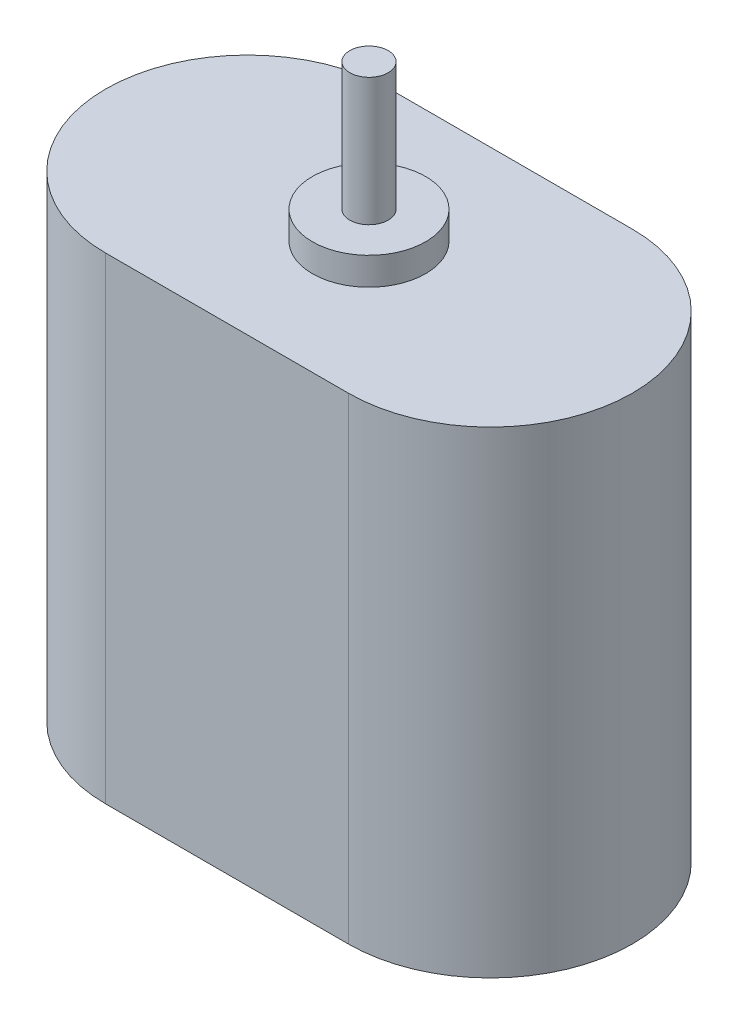
ISO-10303-21;
HEADER;
FILE_DESCRIPTION(('STEP AP214'),'2;1');
FILE_NAME('part.step','',(''),(''),'','','');
FILE_SCHEMA(('AUTOMOTIVE_DESIGN { 1 0 10303 214 1 1 1 1 }'));
ENDSEC;
DATA;
#1=APPLICATION_CONTEXT('core data for automotive mechanical design processes');
#2=APPLICATION_PROTOCOL_DEFINITION('international standard','automotive_design',2000,#1);
#3=PRODUCT_CONTEXT('',#1,'mechanical');
#4=PRODUCT('Part','Part','',(#3));
#5=PRODUCT_RELATED_PRODUCT_CATEGORY('part','',(#4));
#6=PRODUCT_DEFINITION_FORMATION('','',#4);
#7=PRODUCT_DEFINITION_CONTEXT('part definition',#1,'design');
#8=PRODUCT_DEFINITION('design','',#6,#7);
#9=PRODUCT_DEFINITION_SHAPE('','',#8);
#10=(LENGTH_UNIT() NAMED_UNIT(*) SI_UNIT(.MILLI.,.METRE.));
#11=(NAMED_UNIT(*) PLANE_ANGLE_UNIT() SI_UNIT($,.RADIAN.));
#12=(NAMED_UNIT(*) SI_UNIT($,.STERADIAN.) SOLID_ANGLE_UNIT());
#13=UNCERTAINTY_MEASURE_WITH_UNIT(LENGTH_MEASURE(1.E-05),#10,'distance_accuracy_value','');
#14=(GEOMETRIC_REPRESENTATION_CONTEXT(3) GLOBAL_UNCERTAINTY_ASSIGNED_CONTEXT((#13)) GLOBAL_UNIT_ASSIGNED_CONTEXT((#10,
#11,#12)) REPRESENTATION_CONTEXT('',''));
#15=CARTESIAN_POINT('',(0.,0.,0.));
#16=DIRECTION('',(0.,0.,1.));
#17=DIRECTION('',(1.,0.,0.));
#18=AXIS2_PLACEMENT_3D('',#15,#16,#17);
#19=CARTESIAN_POINT('',(0.,0.,0.));
#20=DIRECTION('',(0.,1.,0.));
#21=DIRECTION('',(0.,0.,1.));
#22=AXIS2_PLACEMENT_3D('',#19,#20,#21);
#23=PLANE('',#22);
#24=CARTESIAN_POINT('',(-6.35,0.,0.));
#25=DIRECTION('',(0.,1.,0.));
#26=DIRECTION('',(0.,0.,1.));
#27=AXIS2_PLACEMENT_3D('',#24,#25,#26);
#28=CIRCLE('',#27,7.4295);
#29=CARTESIAN_POINT('',(-6.35,0.,-7.4295));
#30=VERTEX_POINT('',#29);
#31=CARTESIAN_POINT('',(-6.35,0.,7.4295));
#32=VERTEX_POINT('',#31);
#33=EDGE_CURVE('E148',#30,#32,#28,.T.);
#34=ORIENTED_EDGE('',*,*,#33,.F.);
#35=DIRECTION('',(1.,0.,0.));
#36=VECTOR('',#35,1.);
#37=CARTESIAN_POINT('',(0.,0.,-7.4295));
#38=LINE('',#37,#36);
#39=CARTESIAN_POINT('',(6.35,0.,-7.4295));
#40=VERTEX_POINT('',#39);
#41=EDGE_CURVE('E152',#30,#40,#38,.T.);
#42=ORIENTED_EDGE('',*,*,#41,.T.);
#43=CARTESIAN_POINT('',(6.35,0.,0.));
#44=DIRECTION('',(0.,1.,0.));
#45=DIRECTION('',(0.,0.,1.));
#46=AXIS2_PLACEMENT_3D('',#43,#44,#45);
#47=CIRCLE('',#46,7.4295);
#48=CARTESIAN_POINT('',(6.35,0.,7.4295));
#49=VERTEX_POINT('',#48);
#50=EDGE_CURVE('E161',#49,#40,#47,.T.);
#51=ORIENTED_EDGE('',*,*,#50,.F.);
#52=DIRECTION('',(1.,0.,0.));
#53=VECTOR('',#52,1.);
#54=CARTESIAN_POINT('',(0.,0.,7.4295));
#55=LINE('',#54,#53);
#56=EDGE_CURVE('E159',#32,#49,#55,.T.);
#57=ORIENTED_EDGE('',*,*,#56,.F.);
#58=EDGE_LOOP('',(#34,#42,#51,#57));
#59=FACE_BOUND('',#58,.T.);
#60=CARTESIAN_POINT('',(0.,0.,0.));
#61=DIRECTION('',(0.,-1.,0.));
#62=DIRECTION('',(0.,0.,-1.));
#63=AXIS2_PLACEMENT_3D('',#60,#61,#62);
#64=CIRCLE('',#63,4.9022);
#65=CARTESIAN_POINT('',(2.81527806797126,0.,-4.0132));
#66=VERTEX_POINT('',#65);
#67=CARTESIAN_POINT('',(-2.81527806797126,0.,-4.0132));
#68=VERTEX_POINT('',#67);
#69=EDGE_CURVE('E135',#66,#68,#64,.T.);
#70=ORIENTED_EDGE('',*,*,#69,.F.);
#71=DIRECTION('',(1.,0.,0.));
#72=VECTOR('',#71,1.);
#73=CARTESIAN_POINT('',(-2.81527806797126,0.,-4.0132));
#74=LINE('',#73,#72);
#75=EDGE_CURVE('E72',#68,#66,#74,.T.);
#76=ORIENTED_EDGE('',*,*,#75,.F.);
#77=EDGE_LOOP('',(#70,#76));
#78=FACE_BOUND('',#77,.T.);
#79=ADVANCED_FACE('F57',(#59,#78),#23,.F.);
#80=CARTESIAN_POINT('',(-6.35,24.9555,0.));
#81=DIRECTION('',(0.,-1.,0.));
#82=DIRECTION('',(0.,0.,-1.));
#83=AXIS2_PLACEMENT_3D('',#80,#81,#82);
#84=CYLINDRICAL_SURFACE('',#83,7.4295);
#85=ORIENTED_EDGE('',*,*,#33,.T.);
#86=DIRECTION('',(0.,-1.,0.));
#87=VECTOR('',#86,1.);
#88=CARTESIAN_POINT('',(-6.35,24.9555,7.4295));
#89=LINE('',#88,#87);
#90=CARTESIAN_POINT('',(-6.35,24.9555,7.4295));
#91=VERTEX_POINT('',#90);
#92=EDGE_CURVE('E61',#91,#32,#89,.T.);
#93=ORIENTED_EDGE('',*,*,#92,.F.);
#94=CARTESIAN_POINT('',(-6.35,24.9555,0.));
#95=DIRECTION('',(0.,1.,0.));
#96=DIRECTION('',(0.,0.,1.));
#97=AXIS2_PLACEMENT_3D('',#94,#95,#96);
#98=CIRCLE('',#97,7.4295);
#99=CARTESIAN_POINT('',(-6.35,24.9555,-7.4295));
#100=VERTEX_POINT('',#99);
#101=EDGE_CURVE('E150',#100,#91,#98,.T.);
#102=ORIENTED_EDGE('',*,*,#101,.F.);
#103=DIRECTION('',(0.,-1.,0.));
#104=VECTOR('',#103,1.);
#105=CARTESIAN_POINT('',(-6.35,24.9555,-7.4295));
#106=LINE('',#105,#104);
#107=EDGE_CURVE('E81',#100,#30,#106,.T.);
#108=ORIENTED_EDGE('',*,*,#107,.T.);
#109=EDGE_LOOP('',(#85,#93,#102,#108));
#110=FACE_BOUND('',#109,.T.);
#111=ADVANCED_FACE('F59',(#110),#84,.T.);
#112=CARTESIAN_POINT('',(0.,24.9555,7.4295));
#113=DIRECTION('',(0.,0.,-1.));
#114=DIRECTION('',(-1.,0.,0.));
#115=AXIS2_PLACEMENT_3D('',#112,#113,#114);
#116=PLANE('',#115);
#117=ORIENTED_EDGE('',*,*,#56,.T.);
#118=DIRECTION('',(0.,-1.,0.));
#119=VECTOR('',#118,1.);
#120=CARTESIAN_POINT('',(6.35,24.9555,7.4295));
#121=LINE('',#120,#119);
#122=CARTESIAN_POINT('',(6.35,24.9555,7.4295));
#123=VERTEX_POINT('',#122);
#124=EDGE_CURVE('E168',#123,#49,#121,.T.);
#125=ORIENTED_EDGE('',*,*,#124,.F.);
#126=DIRECTION('',(1.,0.,0.));
#127=VECTOR('',#126,1.);
#128=CARTESIAN_POINT('',(0.,24.9555,7.4295));
#129=LINE('',#128,#127);
#130=EDGE_CURVE('E108',#91,#123,#129,.T.);
#131=ORIENTED_EDGE('',*,*,#130,.F.);
#132=ORIENTED_EDGE('',*,*,#92,.T.);
#133=EDGE_LOOP('',(#117,#125,#131,#132));
#134=FACE_BOUND('',#133,.T.);
#135=ADVANCED_FACE('F174',(#134),#116,.F.);
#136=CARTESIAN_POINT('',(6.35,24.9555,0.));
#137=DIRECTION('',(0.,-1.,0.));
#138=DIRECTION('',(0.,0.,-1.));
#139=AXIS2_PLACEMENT_3D('',#136,#137,#138);
#140=CYLINDRICAL_SURFACE('',#139,7.4295);
#141=ORIENTED_EDGE('',*,*,#50,.T.);
#142=DIRECTION('',(0.,-1.,0.));
#143=VECTOR('',#142,1.);
#144=CARTESIAN_POINT('',(6.35,24.9555,-7.4295));
#145=LINE('',#144,#143);
#146=CARTESIAN_POINT('',(6.35,24.9555,-7.4295));
#147=VERTEX_POINT('',#146);
#148=EDGE_CURVE('E167',#147,#40,#145,.T.);
#149=ORIENTED_EDGE('',*,*,#148,.F.);
#150=CARTESIAN_POINT('',(6.35,24.9555,0.));
#151=DIRECTION('',(0.,1.,0.));
#152=DIRECTION('',(0.,0.,1.));
#153=AXIS2_PLACEMENT_3D('',#150,#151,#152);
#154=CIRCLE('',#153,7.4295);
#155=EDGE_CURVE('E154',#123,#147,#154,.T.);
#156=ORIENTED_EDGE('',*,*,#155,.F.);
#157=ORIENTED_EDGE('',*,*,#124,.T.);
#158=EDGE_LOOP('',(#141,#149,#156,#157));
#159=FACE_BOUND('',#158,.T.);
#160=ADVANCED_FACE('F179',(#159),#140,.T.);
#161=CARTESIAN_POINT('',(0.,24.9555,-7.4295));
#162=DIRECTION('',(0.,0.,-1.));
#163=DIRECTION('',(-1.,0.,0.));
#164=AXIS2_PLACEMENT_3D('',#161,#162,#163);
#165=PLANE('',#164);
#166=ORIENTED_EDGE('',*,*,#41,.F.);
#167=ORIENTED_EDGE('',*,*,#107,.F.);
#168=DIRECTION('',(1.,0.,0.));
#169=VECTOR('',#168,1.);
#170=CARTESIAN_POINT('',(0.,24.9555,-7.4295));
#171=LINE('',#170,#169);
#172=EDGE_CURVE('E156',#100,#147,#171,.T.);
#173=ORIENTED_EDGE('',*,*,#172,.T.);
#174=ORIENTED_EDGE('',*,*,#148,.T.);
#175=EDGE_LOOP('',(#166,#167,#173,#174));
#176=FACE_BOUND('',#175,.T.);
#177=ADVANCED_FACE('F176',(#176),#165,.T.);
#178=CARTESIAN_POINT('',(0.,24.9555,0.));
#179=DIRECTION('',(0.,1.,0.));
#180=DIRECTION('',(0.,0.,1.));
#181=AXIS2_PLACEMENT_3D('',#178,#179,#180);
#182=PLANE('',#181);
#183=CARTESIAN_POINT('',(0.,24.9555,0.));
#184=DIRECTION('',(0.,1.,0.));
#185=DIRECTION('',(0.,0.,1.));
#186=AXIS2_PLACEMENT_3D('',#183,#184,#185);
#187=CIRCLE('',#186,2.96037);
#188=CARTESIAN_POINT('',(0.,24.9555,2.96037));
#189=VERTEX_POINT('',#188);
#190=EDGE_CURVE('E13',#189,#189,#187,.T.);
#191=ORIENTED_EDGE('',*,*,#190,.F.);
#192=EDGE_LOOP('',(#191));
#193=FACE_BOUND('',#192,.T.);
#194=ORIENTED_EDGE('',*,*,#101,.T.);
#195=ORIENTED_EDGE('',*,*,#130,.T.);
#196=ORIENTED_EDGE('',*,*,#155,.T.);
#197=ORIENTED_EDGE('',*,*,#172,.F.);
#198=EDGE_LOOP('',(#194,#195,#196,#197));
#199=FACE_BOUND('',#198,.T.);
#200=ADVANCED_FACE('F186',(#193,#199),#182,.T.);
#201=CARTESIAN_POINT('',(0.,26.4033,0.));
#202=DIRECTION('',(0.,1.,0.));
#203=DIRECTION('',(0.,0.,1.));
#204=AXIS2_PLACEMENT_3D('',#201,#202,#203);
#205=PLANE('',#204);
#206=CARTESIAN_POINT('',(0.,26.4033,0.));
#207=DIRECTION('',(0.,1.,0.));
#208=DIRECTION('',(0.,0.,1.));
#209=AXIS2_PLACEMENT_3D('',#206,#207,#208);
#210=CIRCLE('',#209,2.96037);
#211=CARTESIAN_POINT('',(0.,26.4033,2.96037));
#212=VERTEX_POINT('',#211);
#213=EDGE_CURVE('E146',#212,#212,#210,.T.);
#214=ORIENTED_EDGE('',*,*,#213,.T.);
#215=EDGE_LOOP('',(#214));
#216=FACE_BOUND('',#215,.T.);
#217=CARTESIAN_POINT('',(0.,26.4033,0.));
#218=DIRECTION('',(0.,1.,0.));
#219=DIRECTION('',(0.,0.,1.));
#220=AXIS2_PLACEMENT_3D('',#217,#218,#219);
#221=CIRCLE('',#220,1.0033);
#222=CARTESIAN_POINT('',(0.,26.4033,1.0033));
#223=VERTEX_POINT('',#222);
#224=EDGE_CURVE('E139',#223,#223,#221,.T.);
#225=ORIENTED_EDGE('',*,*,#224,.F.);
#226=EDGE_LOOP('',(#225));
#227=FACE_BOUND('',#226,.T.);
#228=ADVANCED_FACE('F198',(#216,#227),#205,.T.);
#229=CARTESIAN_POINT('',(0.,26.4033,0.));
#230=DIRECTION('',(0.,-1.,0.));
#231=DIRECTION('',(0.,0.,-1.));
#232=AXIS2_PLACEMENT_3D('',#229,#230,#231);
#233=CYLINDRICAL_SURFACE('',#232,2.96037);
#234=ORIENTED_EDGE('',*,*,#213,.F.);
#235=EDGE_LOOP('',(#234));
#236=FACE_BOUND('',#235,.T.);
#237=ORIENTED_EDGE('',*,*,#190,.T.);
#238=EDGE_LOOP('',(#237));
#239=FACE_BOUND('',#238,.T.);
#240=ADVANCED_FACE('F200',(#236,#239),#233,.T.);
#241=CARTESIAN_POINT('',(0.,33.0835,0.));
#242=DIRECTION('',(0.,-1.,0.));
#243=DIRECTION('',(0.,0.,-1.));
#244=AXIS2_PLACEMENT_3D('',#241,#242,#243);
#245=CYLINDRICAL_SURFACE('',#244,1.0033);
#246=ORIENTED_EDGE('',*,*,#224,.T.);
#247=EDGE_LOOP('',(#246));
#248=FACE_BOUND('',#247,.T.);
#249=CARTESIAN_POINT('',(0.,33.0835,0.));
#250=DIRECTION('',(0.,1.,0.));
#251=DIRECTION('',(0.,0.,1.));
#252=AXIS2_PLACEMENT_3D('',#249,#250,#251);
#253=CIRCLE('',#252,1.0033);
#254=CARTESIAN_POINT('',(0.,33.0835,1.0033));
#255=VERTEX_POINT('',#254);
#256=EDGE_CURVE('E136',#255,#255,#253,.T.);
#257=ORIENTED_EDGE('',*,*,#256,.F.);
#258=EDGE_LOOP('',(#257));
#259=FACE_BOUND('',#258,.T.);
#260=ADVANCED_FACE('F203',(#248,#259),#245,.T.);
#261=CARTESIAN_POINT('',(0.,33.0835,0.));
#262=DIRECTION('',(0.,1.,0.));
#263=DIRECTION('',(0.,0.,1.));
#264=AXIS2_PLACEMENT_3D('',#261,#262,#263);
#265=PLANE('',#264);
#266=ORIENTED_EDGE('',*,*,#256,.T.);
#267=EDGE_LOOP('',(#266));
#268=FACE_BOUND('',#267,.T.);
#269=ADVANCED_FACE('F210',(#268),#265,.T.);
#270=CARTESIAN_POINT('',(0.,-1.905,0.));
#271=DIRECTION('',(0.,1.,0.));
#272=DIRECTION('',(0.,0.,1.));
#273=AXIS2_PLACEMENT_3D('',#270,#271,#272);
#274=CYLINDRICAL_SURFACE('',#273,4.9022);
#275=ORIENTED_EDGE('',*,*,#69,.T.);
#276=DIRECTION('',(0.,1.,0.));
#277=VECTOR('',#276,1.);
#278=CARTESIAN_POINT('',(-2.81527806797126,-1.905,-4.0132));
#279=LINE('',#278,#277);
#280=CARTESIAN_POINT('',(-2.81527806797126,-1.905,-4.0132));
#281=VERTEX_POINT('',#280);
#282=EDGE_CURVE('E123',#281,#68,#279,.T.);
#283=ORIENTED_EDGE('',*,*,#282,.F.);
#284=CARTESIAN_POINT('',(0.,-1.905,0.));
#285=DIRECTION('',(0.,-1.,0.));
#286=DIRECTION('',(0.,0.,-1.));
#287=AXIS2_PLACEMENT_3D('',#284,#285,#286);
#288=CIRCLE('',#287,4.9022);
#289=CARTESIAN_POINT('',(2.81527806797126,-1.905,-4.0132));
#290=VERTEX_POINT('',#289);
#291=EDGE_CURVE('E129',#290,#281,#288,.T.);
#292=ORIENTED_EDGE('',*,*,#291,.F.);
#293=DIRECTION('',(0.,1.,0.));
#294=VECTOR('',#293,1.);
#295=CARTESIAN_POINT('',(2.81527806797126,-1.905,-4.0132));
#296=LINE('',#295,#294);
#297=EDGE_CURVE('E126',#290,#66,#296,.T.);
#298=ORIENTED_EDGE('',*,*,#297,.T.);
#299=EDGE_LOOP('',(#275,#283,#292,#298));
#300=FACE_BOUND('',#299,.T.);
#301=ADVANCED_FACE('F134',(#300),#274,.T.);
#302=CARTESIAN_POINT('',(-2.81527806797126,-1.905,-4.0132));
#303=DIRECTION('',(0.,0.,1.));
#304=DIRECTION('',(1.,0.,0.));
#305=AXIS2_PLACEMENT_3D('',#302,#303,#304);
#306=PLANE('',#305);
#307=ORIENTED_EDGE('',*,*,#75,.T.);
#308=ORIENTED_EDGE('',*,*,#297,.F.);
#309=DIRECTION('',(1.,0.,0.));
#310=VECTOR('',#309,1.);
#311=CARTESIAN_POINT('',(-2.81527806797126,-1.905,-4.0132));
#312=LINE('',#311,#310);
#313=EDGE_CURVE('E119',#281,#290,#312,.T.);
#314=ORIENTED_EDGE('',*,*,#313,.F.);
#315=ORIENTED_EDGE('',*,*,#282,.T.);
#316=EDGE_LOOP('',(#307,#308,#314,#315));
#317=FACE_BOUND('',#316,.T.);
#318=ADVANCED_FACE('F121',(#317),#306,.F.);
#319=CARTESIAN_POINT('',(0.,-1.905,0.));
#320=DIRECTION('',(0.,-1.,0.));
#321=DIRECTION('',(0.,0.,-1.));
#322=AXIS2_PLACEMENT_3D('',#319,#320,#321);
#323=PLANE('',#322);
#324=ORIENTED_EDGE('',*,*,#291,.T.);
#325=ORIENTED_EDGE('',*,*,#313,.T.);
#326=EDGE_LOOP('',(#324,#325));
#327=FACE_BOUND('',#326,.T.);
#328=ADVANCED_FACE('F131',(#327),#323,.T.);
#329=CLOSED_SHELL('',(#79,#111,#135,#160,#177,#200,#228,#240,#260,#269,#301,#318,#328));
#330=MANIFOLD_SOLID_BREP('B2',#329);
#331=ADVANCED_BREP_SHAPE_REPRESENTATION('',(#18,#330),#14);
#332=SHAPE_DEFINITION_REPRESENTATION(#9,#331);
ENDSEC;
END-ISO-10303-21;
